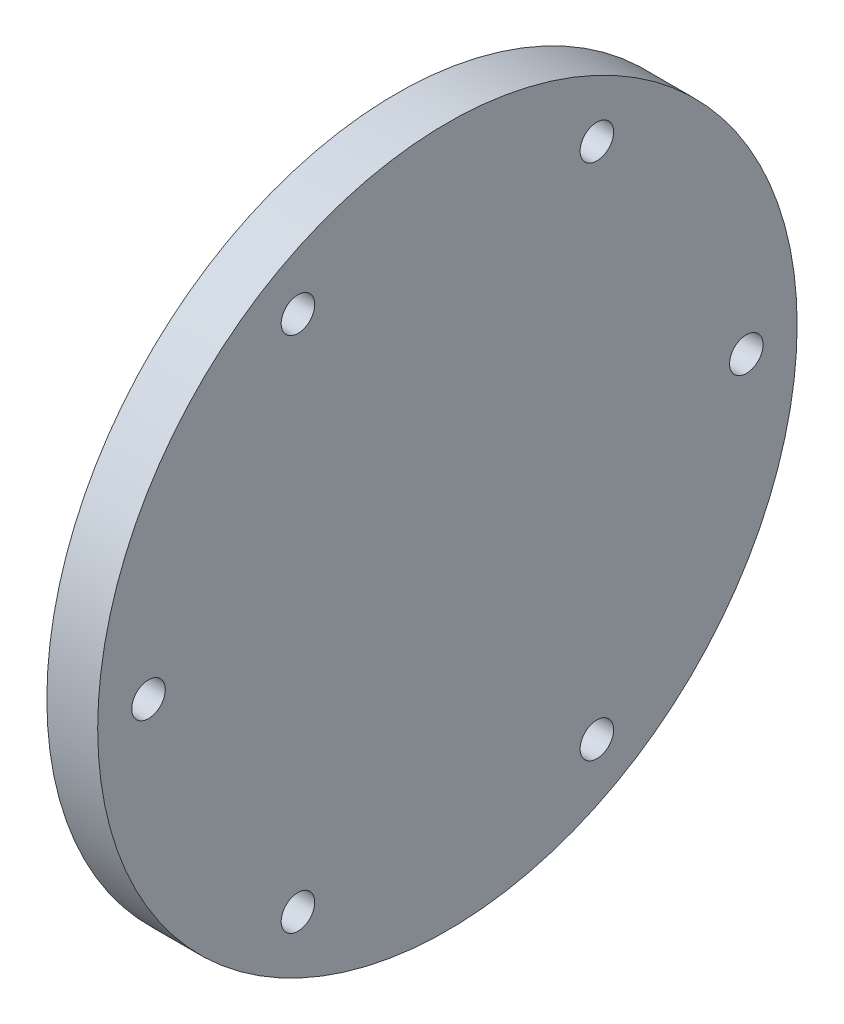
ISO-10303-21;
HEADER;
FILE_DESCRIPTION(('STEP AP214'),'2;1');
FILE_NAME('part.step','',(''),(''),'','','');
FILE_SCHEMA(('AUTOMOTIVE_DESIGN { 1 0 10303 214 1 1 1 1 }'));
ENDSEC;
DATA;
#1=APPLICATION_CONTEXT('core data for automotive mechanical design processes');
#2=APPLICATION_PROTOCOL_DEFINITION('international standard','automotive_design',2000,#1);
#3=PRODUCT_CONTEXT('',#1,'mechanical');
#4=PRODUCT('Part','Part','',(#3));
#5=PRODUCT_RELATED_PRODUCT_CATEGORY('part','',(#4));
#6=PRODUCT_DEFINITION_FORMATION('','',#4);
#7=PRODUCT_DEFINITION_CONTEXT('part definition',#1,'design');
#8=PRODUCT_DEFINITION('design','',#6,#7);
#9=PRODUCT_DEFINITION_SHAPE('','',#8);
#10=(LENGTH_UNIT() NAMED_UNIT(*) SI_UNIT(.MILLI.,.METRE.));
#11=(NAMED_UNIT(*) PLANE_ANGLE_UNIT() SI_UNIT($,.RADIAN.));
#12=(NAMED_UNIT(*) SI_UNIT($,.STERADIAN.) SOLID_ANGLE_UNIT());
#13=UNCERTAINTY_MEASURE_WITH_UNIT(LENGTH_MEASURE(1.E-05),#10,'distance_accuracy_value','');
#14=(GEOMETRIC_REPRESENTATION_CONTEXT(3) GLOBAL_UNCERTAINTY_ASSIGNED_CONTEXT((#13)) GLOBAL_UNIT_ASSIGNED_CONTEXT((#10,
#11,#12)) REPRESENTATION_CONTEXT('',''));
#15=CARTESIAN_POINT('',(0.,0.,0.));
#16=DIRECTION('',(0.,0.,1.));
#17=DIRECTION('',(1.,0.,0.));
#18=AXIS2_PLACEMENT_3D('',#15,#16,#17);
#19=CARTESIAN_POINT('',(163.7,34.4,0.));
#20=DIRECTION('',(1.,0.,0.));
#21=DIRECTION('',(0.,0.,-1.));
#22=AXIS2_PLACEMENT_3D('',#19,#20,#21);
#23=PLANE('',#22);
#24=CARTESIAN_POINT('',(163.7,0.,29.4));
#25=DIRECTION('',(1.,0.,0.));
#26=DIRECTION('',(0.,0.,-1.));
#27=AXIS2_PLACEMENT_3D('',#24,#25,#26);
#28=CIRCLE('',#27,1.65);
#29=CARTESIAN_POINT('',(163.7,0.,27.75));
#30=VERTEX_POINT('',#29);
#31=EDGE_CURVE('E41',#30,#30,#28,.F.);
#32=ORIENTED_EDGE('',*,*,#31,.F.);
#33=EDGE_LOOP('',(#32));
#34=FACE_BOUND('',#33,.T.);
#35=CARTESIAN_POINT('',(163.7,-25.4611468712625,-14.7));
#36=DIRECTION('',(1.,0.,0.));
#37=DIRECTION('',(0.,0.,-1.));
#38=AXIS2_PLACEMENT_3D('',#35,#36,#37);
#39=CIRCLE('',#38,1.65);
#40=CARTESIAN_POINT('',(163.7,-25.4611468712625,-16.35));
#41=VERTEX_POINT('',#40);
#42=EDGE_CURVE('E45',#41,#41,#39,.F.);
#43=ORIENTED_EDGE('',*,*,#42,.F.);
#44=EDGE_LOOP('',(#43));
#45=FACE_BOUND('',#44,.T.);
#46=CARTESIAN_POINT('',(163.7,25.4611468712625,-14.7));
#47=DIRECTION('',(1.,0.,0.));
#48=DIRECTION('',(0.,0.,-1.));
#49=AXIS2_PLACEMENT_3D('',#46,#47,#48);
#50=CIRCLE('',#49,1.65);
#51=CARTESIAN_POINT('',(163.7,25.4611468712625,-16.35));
#52=VERTEX_POINT('',#51);
#53=EDGE_CURVE('E50',#52,#52,#50,.F.);
#54=ORIENTED_EDGE('',*,*,#53,.F.);
#55=EDGE_LOOP('',(#54));
#56=FACE_BOUND('',#55,.T.);
#57=CARTESIAN_POINT('',(163.7,0.,0.));
#58=DIRECTION('',(-1.,0.,0.));
#59=DIRECTION('',(0.,0.,1.));
#60=AXIS2_PLACEMENT_3D('',#57,#58,#59);
#61=CIRCLE('',#60,34.4);
#62=CARTESIAN_POINT('',(163.7,0.,34.4));
#63=VERTEX_POINT('',#62);
#64=EDGE_CURVE('E37',#63,#63,#61,.T.);
#65=ORIENTED_EDGE('',*,*,#64,.T.);
#66=EDGE_LOOP('',(#65));
#67=FACE_BOUND('',#66,.T.);
#68=ADVANCED_FACE('F31',(#34,#45,#56,#67),#23,.F.);
#69=CARTESIAN_POINT('',(168.7,0.,0.));
#70=DIRECTION('',(-1.,0.,0.));
#71=DIRECTION('',(0.,0.,1.));
#72=AXIS2_PLACEMENT_3D('',#69,#70,#71);
#73=PLANE('',#72);
#74=CARTESIAN_POINT('',(168.7,0.,-29.4));
#75=DIRECTION('',(1.,0.,0.));
#76=DIRECTION('',(0.,0.,-1.));
#77=AXIS2_PLACEMENT_3D('',#74,#75,#76);
#78=CIRCLE('',#77,1.65);
#79=CARTESIAN_POINT('',(168.7,0.,-31.05));
#80=VERTEX_POINT('',#79);
#81=EDGE_CURVE('E58',#80,#80,#78,.T.);
#82=ORIENTED_EDGE('',*,*,#81,.F.);
#83=EDGE_LOOP('',(#82));
#84=FACE_BOUND('',#83,.T.);
#85=CARTESIAN_POINT('',(168.7,25.4611468712625,14.7));
#86=DIRECTION('',(1.,0.,0.));
#87=DIRECTION('',(0.,0.,-1.));
#88=AXIS2_PLACEMENT_3D('',#85,#86,#87);
#89=CIRCLE('',#88,1.65);
#90=CARTESIAN_POINT('',(168.7,25.4611468712625,13.05));
#91=VERTEX_POINT('',#90);
#92=EDGE_CURVE('E72',#91,#91,#89,.T.);
#93=ORIENTED_EDGE('',*,*,#92,.F.);
#94=EDGE_LOOP('',(#93));
#95=FACE_BOUND('',#94,.T.);
#96=CARTESIAN_POINT('',(168.7,-25.4611468712625,14.7));
#97=DIRECTION('',(1.,0.,0.));
#98=DIRECTION('',(0.,0.,-1.));
#99=AXIS2_PLACEMENT_3D('',#96,#97,#98);
#100=CIRCLE('',#99,1.65);
#101=CARTESIAN_POINT('',(168.7,-25.4611468712625,13.05));
#102=VERTEX_POINT('',#101);
#103=EDGE_CURVE('E66',#102,#102,#100,.T.);
#104=ORIENTED_EDGE('',*,*,#103,.F.);
#105=EDGE_LOOP('',(#104));
#106=FACE_BOUND('',#105,.T.);
#107=CARTESIAN_POINT('',(168.7,0.,29.4));
#108=DIRECTION('',(1.,0.,0.));
#109=DIRECTION('',(0.,0.,-1.));
#110=AXIS2_PLACEMENT_3D('',#107,#108,#109);
#111=CIRCLE('',#110,1.65);
#112=CARTESIAN_POINT('',(168.7,0.,27.75));
#113=VERTEX_POINT('',#112);
#114=EDGE_CURVE('E53',#113,#113,#111,.T.);
#115=ORIENTED_EDGE('',*,*,#114,.F.);
#116=EDGE_LOOP('',(#115));
#117=FACE_BOUND('',#116,.T.);
#118=CARTESIAN_POINT('',(168.7,-25.4611468712625,-14.7));
#119=DIRECTION('',(1.,0.,0.));
#120=DIRECTION('',(0.,0.,-1.));
#121=AXIS2_PLACEMENT_3D('',#118,#119,#120);
#122=CIRCLE('',#121,1.65);
#123=CARTESIAN_POINT('',(168.7,-25.4611468712625,-16.35));
#124=VERTEX_POINT('',#123);
#125=EDGE_CURVE('E57',#124,#124,#122,.T.);
#126=ORIENTED_EDGE('',*,*,#125,.F.);
#127=EDGE_LOOP('',(#126));
#128=FACE_BOUND('',#127,.T.);
#129=CARTESIAN_POINT('',(168.7,25.4611468712625,-14.7));
#130=DIRECTION('',(1.,0.,0.));
#131=DIRECTION('',(0.,0.,-1.));
#132=AXIS2_PLACEMENT_3D('',#129,#130,#131);
#133=CIRCLE('',#132,1.65);
#134=CARTESIAN_POINT('',(168.7,25.4611468712625,-16.35));
#135=VERTEX_POINT('',#134);
#136=EDGE_CURVE('E54',#135,#135,#133,.T.);
#137=ORIENTED_EDGE('',*,*,#136,.F.);
#138=EDGE_LOOP('',(#137));
#139=FACE_BOUND('',#138,.T.);
#140=CARTESIAN_POINT('',(168.7,0.,0.));
#141=DIRECTION('',(-1.,0.,0.));
#142=DIRECTION('',(0.,0.,1.));
#143=AXIS2_PLACEMENT_3D('',#140,#141,#142);
#144=CIRCLE('',#143,34.4);
#145=CARTESIAN_POINT('',(168.7,0.,34.4));
#146=VERTEX_POINT('',#145);
#147=EDGE_CURVE('E10',#146,#146,#144,.T.);
#148=ORIENTED_EDGE('',*,*,#147,.F.);
#149=EDGE_LOOP('',(#148));
#150=FACE_BOUND('',#149,.T.);
#151=ADVANCED_FACE('F84',(#84,#95,#106,#117,#128,#139,#150),#73,.F.);
#152=CARTESIAN_POINT('',(-110.,0.,0.));
#153=DIRECTION('',(-1.,0.,0.));
#154=DIRECTION('',(0.,0.,1.));
#155=AXIS2_PLACEMENT_3D('',#152,#153,#154);
#156=CYLINDRICAL_SURFACE('',#155,34.4);
#157=ORIENTED_EDGE('',*,*,#64,.F.);
#158=EDGE_LOOP('',(#157));
#159=FACE_BOUND('',#158,.T.);
#160=ORIENTED_EDGE('',*,*,#147,.T.);
#161=EDGE_LOOP('',(#160));
#162=FACE_BOUND('',#161,.T.);
#163=ADVANCED_FACE('F87',(#159,#162),#156,.T.);
#164=CARTESIAN_POINT('',(168.7,25.4611468712625,-14.7));
#165=DIRECTION('',(-1.,0.,0.));
#166=DIRECTION('',(0.,0.,1.));
#167=AXIS2_PLACEMENT_3D('',#164,#165,#166);
#168=CYLINDRICAL_SURFACE('',#167,1.65);
#169=ORIENTED_EDGE('',*,*,#136,.T.);
#170=EDGE_LOOP('',(#169));
#171=FACE_BOUND('',#170,.T.);
#172=ORIENTED_EDGE('',*,*,#53,.T.);
#173=EDGE_LOOP('',(#172));
#174=FACE_BOUND('',#173,.T.);
#175=ADVANCED_FACE('F99',(#171,#174),#168,.F.);
#176=CARTESIAN_POINT('',(168.7,-25.4611468712625,-14.7));
#177=DIRECTION('',(-1.,0.,0.));
#178=DIRECTION('',(0.,0.,1.));
#179=AXIS2_PLACEMENT_3D('',#176,#177,#178);
#180=CYLINDRICAL_SURFACE('',#179,1.65);
#181=ORIENTED_EDGE('',*,*,#125,.T.);
#182=EDGE_LOOP('',(#181));
#183=FACE_BOUND('',#182,.T.);
#184=ORIENTED_EDGE('',*,*,#42,.T.);
#185=EDGE_LOOP('',(#184));
#186=FACE_BOUND('',#185,.T.);
#187=ADVANCED_FACE('F102',(#183,#186),#180,.F.);
#188=CARTESIAN_POINT('',(168.7,0.,29.4));
#189=DIRECTION('',(-1.,0.,0.));
#190=DIRECTION('',(0.,0.,1.));
#191=AXIS2_PLACEMENT_3D('',#188,#189,#190);
#192=CYLINDRICAL_SURFACE('',#191,1.65);
#193=ORIENTED_EDGE('',*,*,#114,.T.);
#194=EDGE_LOOP('',(#193));
#195=FACE_BOUND('',#194,.T.);
#196=ORIENTED_EDGE('',*,*,#31,.T.);
#197=EDGE_LOOP('',(#196));
#198=FACE_BOUND('',#197,.T.);
#199=ADVANCED_FACE('F115',(#195,#198),#192,.F.);
#200=CARTESIAN_POINT('',(168.7,-25.4611468712625,14.7));
#201=DIRECTION('',(-1.,0.,0.));
#202=DIRECTION('',(0.,0.,1.));
#203=AXIS2_PLACEMENT_3D('',#200,#201,#202);
#204=CYLINDRICAL_SURFACE('',#203,1.65);
#205=ORIENTED_EDGE('',*,*,#103,.T.);
#206=EDGE_LOOP('',(#205));
#207=FACE_BOUND('',#206,.T.);
#208=CARTESIAN_POINT('',(165.2,-25.4611468712625,14.7));
#209=DIRECTION('',(1.,0.,0.));
#210=DIRECTION('',(0.,0.,-1.));
#211=AXIS2_PLACEMENT_3D('',#208,#209,#210);
#212=CIRCLE('',#211,1.65);
#213=CARTESIAN_POINT('',(165.2,-25.4611468712625,13.05));
#214=VERTEX_POINT('',#213);
#215=EDGE_CURVE('E63',#214,#214,#212,.T.);
#216=ORIENTED_EDGE('',*,*,#215,.F.);
#217=EDGE_LOOP('',(#216));
#218=FACE_BOUND('',#217,.T.);
#219=ADVANCED_FACE('F121',(#207,#218),#204,.F.);
#220=CARTESIAN_POINT('',(165.2,-25.4611468712625,14.7));
#221=DIRECTION('',(1.,0.,0.));
#222=DIRECTION('',(0.,0.,-1.));
#223=AXIS2_PLACEMENT_3D('',#220,#221,#222);
#224=PLANE('',#223);
#225=ORIENTED_EDGE('',*,*,#215,.T.);
#226=EDGE_LOOP('',(#225));
#227=FACE_BOUND('',#226,.T.);
#228=ADVANCED_FACE('F161',(#227),#224,.T.);
#229=CARTESIAN_POINT('',(168.7,25.4611468712625,14.7));
#230=DIRECTION('',(-1.,0.,0.));
#231=DIRECTION('',(0.,0.,1.));
#232=AXIS2_PLACEMENT_3D('',#229,#230,#231);
#233=CYLINDRICAL_SURFACE('',#232,1.65);
#234=ORIENTED_EDGE('',*,*,#92,.T.);
#235=EDGE_LOOP('',(#234));
#236=FACE_BOUND('',#235,.T.);
#237=CARTESIAN_POINT('',(165.2,25.4611468712625,14.7));
#238=DIRECTION('',(1.,0.,0.));
#239=DIRECTION('',(0.,0.,-1.));
#240=AXIS2_PLACEMENT_3D('',#237,#238,#239);
#241=CIRCLE('',#240,1.65);
#242=CARTESIAN_POINT('',(165.2,25.4611468712625,13.05));
#243=VERTEX_POINT('',#242);
#244=EDGE_CURVE('E69',#243,#243,#241,.T.);
#245=ORIENTED_EDGE('',*,*,#244,.F.);
#246=EDGE_LOOP('',(#245));
#247=FACE_BOUND('',#246,.T.);
#248=ADVANCED_FACE('F170',(#236,#247),#233,.F.);
#249=CARTESIAN_POINT('',(165.2,25.4611468712625,14.7));
#250=DIRECTION('',(1.,0.,0.));
#251=DIRECTION('',(0.,0.,-1.));
#252=AXIS2_PLACEMENT_3D('',#249,#250,#251);
#253=PLANE('',#252);
#254=ORIENTED_EDGE('',*,*,#244,.T.);
#255=EDGE_LOOP('',(#254));
#256=FACE_BOUND('',#255,.T.);
#257=ADVANCED_FACE('F180',(#256),#253,.T.);
#258=CARTESIAN_POINT('',(168.7,0.,-29.4));
#259=DIRECTION('',(-1.,0.,0.));
#260=DIRECTION('',(0.,0.,1.));
#261=AXIS2_PLACEMENT_3D('',#258,#259,#260);
#262=CYLINDRICAL_SURFACE('',#261,1.65);
#263=ORIENTED_EDGE('',*,*,#81,.T.);
#264=EDGE_LOOP('',(#263));
#265=FACE_BOUND('',#264,.T.);
#266=CARTESIAN_POINT('',(165.2,0.,-29.4));
#267=DIRECTION('',(1.,0.,0.));
#268=DIRECTION('',(0.,0.,-1.));
#269=AXIS2_PLACEMENT_3D('',#266,#267,#268);
#270=CIRCLE('',#269,1.65);
#271=CARTESIAN_POINT('',(165.2,0.,-31.05));
#272=VERTEX_POINT('',#271);
#273=EDGE_CURVE('E75',#272,#272,#270,.T.);
#274=ORIENTED_EDGE('',*,*,#273,.F.);
#275=EDGE_LOOP('',(#274));
#276=FACE_BOUND('',#275,.T.);
#277=ADVANCED_FACE('F81',(#265,#276),#262,.F.);
#278=CARTESIAN_POINT('',(165.2,0.,-29.4));
#279=DIRECTION('',(1.,0.,0.));
#280=DIRECTION('',(0.,0.,-1.));
#281=AXIS2_PLACEMENT_3D('',#278,#279,#280);
#282=PLANE('',#281);
#283=ORIENTED_EDGE('',*,*,#273,.T.);
#284=EDGE_LOOP('',(#283));
#285=FACE_BOUND('',#284,.T.);
#286=ADVANCED_FACE('F199',(#285),#282,.T.);
#287=CLOSED_SHELL('',(#68,#151,#163,#175,#187,#199,#219,#228,#248,#257,#277,#286));
#288=MANIFOLD_SOLID_BREP('B2',#287);
#289=ADVANCED_BREP_SHAPE_REPRESENTATION('',(#18,#288),#14);
#290=SHAPE_DEFINITION_REPRESENTATION(#9,#289);
ENDSEC;
END-ISO-10303-21;
